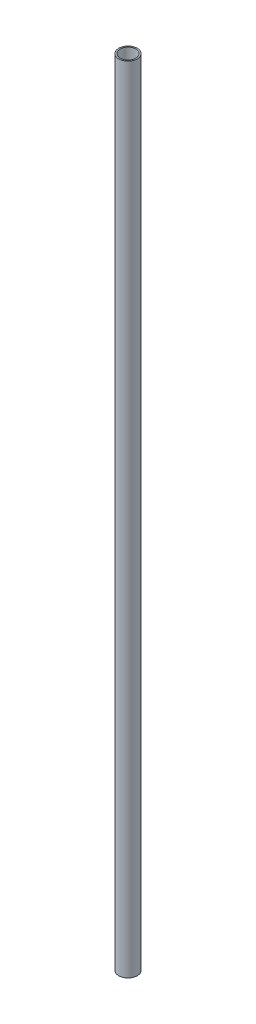
ISO-10303-21;
HEADER;
FILE_DESCRIPTION(('STEP AP214'),'2;1');
FILE_NAME('part.step','',(''),(''),'','','');
FILE_SCHEMA(('AUTOMOTIVE_DESIGN { 1 0 10303 214 1 1 1 1 }'));
ENDSEC;
DATA;
#1=APPLICATION_CONTEXT('core data for automotive mechanical design processes');
#2=APPLICATION_PROTOCOL_DEFINITION('international standard','automotive_design',2000,#1);
#3=PRODUCT_CONTEXT('',#1,'mechanical');
#4=PRODUCT('Part','Part','',(#3));
#5=PRODUCT_RELATED_PRODUCT_CATEGORY('part','',(#4));
#6=PRODUCT_DEFINITION_FORMATION('','',#4);
#7=PRODUCT_DEFINITION_CONTEXT('part definition',#1,'design');
#8=PRODUCT_DEFINITION('design','',#6,#7);
#9=PRODUCT_DEFINITION_SHAPE('','',#8);
#10=(LENGTH_UNIT() NAMED_UNIT(*) SI_UNIT(.MILLI.,.METRE.));
#11=(NAMED_UNIT(*) PLANE_ANGLE_UNIT() SI_UNIT($,.RADIAN.));
#12=(NAMED_UNIT(*) SI_UNIT($,.STERADIAN.) SOLID_ANGLE_UNIT());
#13=UNCERTAINTY_MEASURE_WITH_UNIT(LENGTH_MEASURE(1.E-05),#10,'distance_accuracy_value','');
#14=(GEOMETRIC_REPRESENTATION_CONTEXT(3) GLOBAL_UNCERTAINTY_ASSIGNED_CONTEXT((#13)) GLOBAL_UNIT_ASSIGNED_CONTEXT((#10,
#11,#12)) REPRESENTATION_CONTEXT('',''));
#15=CARTESIAN_POINT('',(0.,0.,0.));
#16=DIRECTION('',(0.,0.,1.));
#17=DIRECTION('',(1.,0.,0.));
#18=AXIS2_PLACEMENT_3D('',#15,#16,#17);
#19=CARTESIAN_POINT('',(0.,600.,0.));
#20=DIRECTION('',(0.,1.,0.));
#21=DIRECTION('',(0.,0.,1.));
#22=AXIS2_PLACEMENT_3D('',#19,#20,#21);
#23=PLANE('',#22);
#24=CARTESIAN_POINT('',(0.,600.,0.));
#25=DIRECTION('',(0.,1.,0.));
#26=DIRECTION('',(0.,0.,1.));
#27=AXIS2_PLACEMENT_3D('',#24,#25,#26);
#28=CIRCLE('',#27,7.);
#29=CARTESIAN_POINT('',(0.,600.,7.));
#30=VERTEX_POINT('',#29);
#31=EDGE_CURVE('E10',#30,#30,#28,.T.);
#32=ORIENTED_EDGE('',*,*,#31,.T.);
#33=EDGE_LOOP('',(#32));
#34=FACE_BOUND('',#33,.T.);
#35=CARTESIAN_POINT('',(0.,600.,0.));
#36=DIRECTION('',(0.,1.,0.));
#37=DIRECTION('',(0.,0.,1.));
#38=AXIS2_PLACEMENT_3D('',#35,#36,#37);
#39=CIRCLE('',#38,6.);
#40=CARTESIAN_POINT('',(0.,600.,6.));
#41=VERTEX_POINT('',#40);
#42=EDGE_CURVE('E46',#41,#41,#39,.T.);
#43=ORIENTED_EDGE('',*,*,#42,.F.);
#44=EDGE_LOOP('',(#43));
#45=FACE_BOUND('',#44,.T.);
#46=ADVANCED_FACE('F35',(#34,#45),#23,.T.);
#47=CARTESIAN_POINT('',(0.,0.,0.));
#48=DIRECTION('',(0.,1.,0.));
#49=DIRECTION('',(0.,0.,1.));
#50=AXIS2_PLACEMENT_3D('',#47,#48,#49);
#51=PLANE('',#50);
#52=CARTESIAN_POINT('',(0.,0.,0.));
#53=DIRECTION('',(0.,1.,0.));
#54=DIRECTION('',(0.,0.,1.));
#55=AXIS2_PLACEMENT_3D('',#52,#53,#54);
#56=CIRCLE('',#55,7.);
#57=CARTESIAN_POINT('',(0.,0.,7.));
#58=VERTEX_POINT('',#57);
#59=EDGE_CURVE('E39',#58,#58,#56,.T.);
#60=ORIENTED_EDGE('',*,*,#59,.F.);
#61=EDGE_LOOP('',(#60));
#62=FACE_BOUND('',#61,.T.);
#63=CARTESIAN_POINT('',(0.,0.,0.));
#64=DIRECTION('',(0.,1.,0.));
#65=DIRECTION('',(0.,0.,1.));
#66=AXIS2_PLACEMENT_3D('',#63,#64,#65);
#67=CIRCLE('',#66,6.);
#68=CARTESIAN_POINT('',(0.,0.,6.));
#69=VERTEX_POINT('',#68);
#70=EDGE_CURVE('E48',#69,#69,#67,.T.);
#71=ORIENTED_EDGE('',*,*,#70,.T.);
#72=EDGE_LOOP('',(#71));
#73=FACE_BOUND('',#72,.T.);
#74=ADVANCED_FACE('F58',(#62,#73),#51,.F.);
#75=CARTESIAN_POINT('',(0.,600.,0.));
#76=DIRECTION('',(0.,-1.,0.));
#77=DIRECTION('',(0.,0.,-1.));
#78=AXIS2_PLACEMENT_3D('',#75,#76,#77);
#79=CYLINDRICAL_SURFACE('',#78,7.);
#80=ORIENTED_EDGE('',*,*,#31,.F.);
#81=EDGE_LOOP('',(#80));
#82=FACE_BOUND('',#81,.T.);
#83=ORIENTED_EDGE('',*,*,#59,.T.);
#84=EDGE_LOOP('',(#83));
#85=FACE_BOUND('',#84,.T.);
#86=ADVANCED_FACE('F37',(#82,#85),#79,.T.);
#87=CARTESIAN_POINT('',(0.,600.,0.));
#88=DIRECTION('',(0.,-1.,0.));
#89=DIRECTION('',(0.,0.,-1.));
#90=AXIS2_PLACEMENT_3D('',#87,#88,#89);
#91=CYLINDRICAL_SURFACE('',#90,6.);
#92=ORIENTED_EDGE('',*,*,#42,.T.);
#93=EDGE_LOOP('',(#92));
#94=FACE_BOUND('',#93,.T.);
#95=ORIENTED_EDGE('',*,*,#70,.F.);
#96=EDGE_LOOP('',(#95));
#97=FACE_BOUND('',#96,.T.);
#98=ADVANCED_FACE('F54',(#94,#97),#91,.F.);
#99=CLOSED_SHELL('',(#46,#74,#86,#98));
#100=MANIFOLD_SOLID_BREP('B2',#99);
#101=ADVANCED_BREP_SHAPE_REPRESENTATION('',(#18,#100),#14);
#102=SHAPE_DEFINITION_REPRESENTATION(#9,#101);
ENDSEC;
END-ISO-10303-21;
